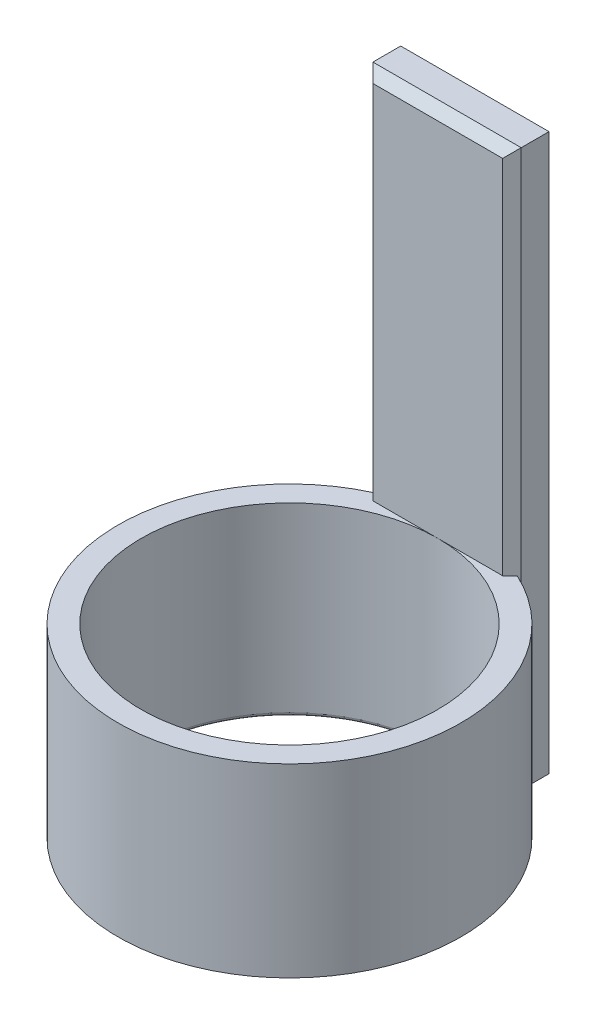
ISO-10303-21;
HEADER;
FILE_DESCRIPTION(('STEP AP214'),'2;1');
FILE_NAME('part.step','',(''),(''),'','','');
FILE_SCHEMA(('AUTOMOTIVE_DESIGN { 1 0 10303 214 1 1 1 1 }'));
ENDSEC;
DATA;
#1=APPLICATION_CONTEXT('core data for automotive mechanical design processes');
#2=APPLICATION_PROTOCOL_DEFINITION('international standard','automotive_design',2000,#1);
#3=PRODUCT_CONTEXT('',#1,'mechanical');
#4=PRODUCT('Part','Part','',(#3));
#5=PRODUCT_RELATED_PRODUCT_CATEGORY('part','',(#4));
#6=PRODUCT_DEFINITION_FORMATION('','',#4);
#7=PRODUCT_DEFINITION_CONTEXT('part definition',#1,'design');
#8=PRODUCT_DEFINITION('design','',#6,#7);
#9=PRODUCT_DEFINITION_SHAPE('','',#8);
#10=(LENGTH_UNIT() NAMED_UNIT(*) SI_UNIT(.MILLI.,.METRE.));
#11=(NAMED_UNIT(*) PLANE_ANGLE_UNIT() SI_UNIT($,.RADIAN.));
#12=(NAMED_UNIT(*) SI_UNIT($,.STERADIAN.) SOLID_ANGLE_UNIT());
#13=UNCERTAINTY_MEASURE_WITH_UNIT(LENGTH_MEASURE(1.E-05),#10,'distance_accuracy_value','');
#14=(GEOMETRIC_REPRESENTATION_CONTEXT(3) GLOBAL_UNCERTAINTY_ASSIGNED_CONTEXT((#13)) GLOBAL_UNIT_ASSIGNED_CONTEXT((#10,
#11,#12)) REPRESENTATION_CONTEXT('',''));
#15=CARTESIAN_POINT('',(0.,0.,0.));
#16=DIRECTION('',(0.,0.,1.));
#17=DIRECTION('',(1.,0.,0.));
#18=AXIS2_PLACEMENT_3D('',#15,#16,#17);
#19=CARTESIAN_POINT('',(0.,10.,0.));
#20=DIRECTION('',(0.,1.,0.));
#21=DIRECTION('',(0.,0.,1.));
#22=AXIS2_PLACEMENT_3D('',#19,#20,#21);
#23=PLANE('',#22);
#24=CARTESIAN_POINT('',(0.,10.,0.));
#25=DIRECTION('',(0.,1.,0.));
#26=DIRECTION('',(0.,0.,1.));
#27=AXIS2_PLACEMENT_3D('',#24,#25,#26);
#28=CIRCLE('',#27,9.25);
#29=CARTESIAN_POINT('',(-3.89155924826912,10.,-8.39155924826912));
#30=VERTEX_POINT('',#29);
#31=CARTESIAN_POINT('',(3.89155924826912,10.,-8.39155924826912));
#32=VERTEX_POINT('',#31);
#33=EDGE_CURVE('E52',#30,#32,#28,.T.);
#34=ORIENTED_EDGE('',*,*,#33,.T.);
#35=DIRECTION('',(0.707106781186548,0.,-0.707106781186548));
#36=VECTOR('',#35,1.);
#37=CARTESIAN_POINT('',(3.5,10.,-8.));
#38=LINE('',#37,#36);
#39=CARTESIAN_POINT('',(3.5,10.,-8.));
#40=VERTEX_POINT('',#39);
#41=EDGE_CURVE('E11',#32,#40,#38,.F.);
#42=ORIENTED_EDGE('',*,*,#41,.T.);
#43=DIRECTION('',(1.,0.,0.));
#44=VECTOR('',#43,1.);
#45=CARTESIAN_POINT('',(0.,10.,-8.));
#46=LINE('',#45,#44);
#47=CARTESIAN_POINT('',(0.,10.,-8.));
#48=VERTEX_POINT('',#47);
#49=EDGE_CURVE('E136',#48,#40,#46,.T.);
#50=ORIENTED_EDGE('',*,*,#49,.F.);
#51=CARTESIAN_POINT('',(0.,10.,0.));
#52=DIRECTION('',(0.,1.,0.));
#53=DIRECTION('',(0.,0.,1.));
#54=AXIS2_PLACEMENT_3D('',#51,#52,#53);
#55=CIRCLE('',#54,8.);
#56=EDGE_CURVE('E144',#48,#48,#55,.T.);
#57=ORIENTED_EDGE('',*,*,#56,.F.);
#58=CARTESIAN_POINT('',(-3.5,10.,-8.));
#59=VERTEX_POINT('',#58);
#60=EDGE_CURVE('E143',#59,#48,#46,.T.);
#61=ORIENTED_EDGE('',*,*,#60,.F.);
#62=DIRECTION('',(0.707106781186548,0.,0.707106781186548));
#63=VECTOR('',#62,1.);
#64=CARTESIAN_POINT('',(-3.5,10.,-8.));
#65=LINE('',#64,#63);
#66=EDGE_CURVE('E173',#59,#30,#65,.F.);
#67=ORIENTED_EDGE('',*,*,#66,.T.);
#68=EDGE_LOOP('',(#34,#42,#50,#57,#61,#67));
#69=FACE_BOUND('',#68,.T.);
#70=ADVANCED_FACE('F35',(#69),#23,.T.);
#71=CARTESIAN_POINT('',(0.,0.,0.));
#72=DIRECTION('',(0.,1.,0.));
#73=DIRECTION('',(0.,0.,1.));
#74=AXIS2_PLACEMENT_3D('',#71,#72,#73);
#75=PLANE('',#74);
#76=CARTESIAN_POINT('',(0.,0.,0.));
#77=DIRECTION('',(0.,1.,0.));
#78=DIRECTION('',(0.,0.,1.));
#79=AXIS2_PLACEMENT_3D('',#76,#77,#78);
#80=CIRCLE('',#79,8.2);
#81=CARTESIAN_POINT('',(0.,0.,8.2));
#82=VERTEX_POINT('',#81);
#83=EDGE_CURVE('E149',#82,#82,#80,.T.);
#84=ORIENTED_EDGE('',*,*,#83,.T.);
#85=EDGE_LOOP('',(#84));
#86=FACE_BOUND('',#85,.T.);
#87=CARTESIAN_POINT('',(0.,0.,0.));
#88=DIRECTION('',(0.,1.,0.));
#89=DIRECTION('',(0.,0.,1.));
#90=AXIS2_PLACEMENT_3D('',#87,#88,#89);
#91=CIRCLE('',#90,9.25);
#92=CARTESIAN_POINT('',(-3.89155924826912,0.,-8.39155924826913));
#93=VERTEX_POINT('',#92);
#94=CARTESIAN_POINT('',(3.89155924826912,0.,-8.39155924826913));
#95=VERTEX_POINT('',#94);
#96=EDGE_CURVE('E147',#93,#95,#91,.T.);
#97=ORIENTED_EDGE('',*,*,#96,.F.);
#98=DIRECTION('',(0.707106781186548,0.,0.707106781186548));
#99=VECTOR('',#98,1.);
#100=CARTESIAN_POINT('',(-3.5,0.,-8.));
#101=LINE('',#100,#99);
#102=CARTESIAN_POINT('',(-4.,0.,-8.5));
#103=VERTEX_POINT('',#102);
#104=EDGE_CURVE('E166',#93,#103,#101,.F.);
#105=ORIENTED_EDGE('',*,*,#104,.T.);
#106=DIRECTION('',(0.,0.,1.));
#107=VECTOR('',#106,1.);
#108=CARTESIAN_POINT('',(-4.,0.,-10.));
#109=LINE('',#108,#107);
#110=CARTESIAN_POINT('',(-4.,0.,-10.));
#111=VERTEX_POINT('',#110);
#112=EDGE_CURVE('E137',#111,#103,#109,.T.);
#113=ORIENTED_EDGE('',*,*,#112,.F.);
#114=DIRECTION('',(1.,0.,0.));
#115=VECTOR('',#114,1.);
#116=CARTESIAN_POINT('',(4.,0.,-10.));
#117=LINE('',#116,#115);
#118=CARTESIAN_POINT('',(4.,0.,-10.));
#119=VERTEX_POINT('',#118);
#120=EDGE_CURVE('E114',#111,#119,#117,.T.);
#121=ORIENTED_EDGE('',*,*,#120,.T.);
#122=DIRECTION('',(0.,0.,1.));
#123=VECTOR('',#122,1.);
#124=CARTESIAN_POINT('',(4.,0.,-10.));
#125=LINE('',#124,#123);
#126=CARTESIAN_POINT('',(4.,0.,-8.5));
#127=VERTEX_POINT('',#126);
#128=EDGE_CURVE('E128',#119,#127,#125,.T.);
#129=ORIENTED_EDGE('',*,*,#128,.T.);
#130=DIRECTION('',(0.707106781186548,0.,-0.707106781186548));
#131=VECTOR('',#130,1.);
#132=CARTESIAN_POINT('',(3.5,0.,-8.));
#133=LINE('',#132,#131);
#134=EDGE_CURVE('E163',#127,#95,#133,.F.);
#135=ORIENTED_EDGE('',*,*,#134,.T.);
#136=EDGE_LOOP('',(#97,#105,#113,#121,#129,#135));
#137=FACE_BOUND('',#136,.T.);
#138=ADVANCED_FACE('F194',(#86,#137),#75,.F.);
#139=CARTESIAN_POINT('',(0.,10.,0.));
#140=DIRECTION('',(0.,-1.,0.));
#141=DIRECTION('',(0.,0.,-1.));
#142=AXIS2_PLACEMENT_3D('',#139,#140,#141);
#143=CYLINDRICAL_SURFACE('',#142,9.25);
#144=ORIENTED_EDGE('',*,*,#96,.T.);
#145=DIRECTION('',(0.,-1.,0.));
#146=VECTOR('',#145,1.);
#147=CARTESIAN_POINT('',(3.89155924826912,0.,-8.39155924826913));
#148=LINE('',#147,#146);
#149=EDGE_CURVE('E45',#95,#32,#148,.F.);
#150=ORIENTED_EDGE('',*,*,#149,.T.);
#151=ORIENTED_EDGE('',*,*,#33,.F.);
#152=DIRECTION('',(0.,-1.,0.));
#153=VECTOR('',#152,1.);
#154=CARTESIAN_POINT('',(-3.89155924826912,10.,-8.39155924826912));
#155=LINE('',#154,#153);
#156=EDGE_CURVE('E175',#30,#93,#155,.T.);
#157=ORIENTED_EDGE('',*,*,#156,.T.);
#158=EDGE_LOOP('',(#144,#150,#151,#157));
#159=FACE_BOUND('',#158,.T.);
#160=ADVANCED_FACE('F212',(#159),#143,.T.);
#161=CARTESIAN_POINT('',(0.,10.,0.));
#162=DIRECTION('',(0.,-1.,0.));
#163=DIRECTION('',(0.,0.,-1.));
#164=AXIS2_PLACEMENT_3D('',#161,#162,#163);
#165=CYLINDRICAL_SURFACE('',#164,8.);
#166=CARTESIAN_POINT('',(0.,0.200000000000001,0.));
#167=DIRECTION('',(0.,1.,0.));
#168=DIRECTION('',(0.,0.,1.));
#169=AXIS2_PLACEMENT_3D('',#166,#167,#168);
#170=CIRCLE('',#169,8.);
#171=CARTESIAN_POINT('',(0.,0.200000000000001,8.));
#172=VERTEX_POINT('',#171);
#173=EDGE_CURVE('E153',#172,#172,#170,.F.);
#174=ORIENTED_EDGE('',*,*,#173,.T.);
#175=EDGE_LOOP('',(#174));
#176=FACE_BOUND('',#175,.T.);
#177=ORIENTED_EDGE('',*,*,#56,.T.);
#178=EDGE_LOOP('',(#177));
#179=FACE_BOUND('',#178,.T.);
#180=ADVANCED_FACE('F204',(#176,#179),#165,.F.);
#181=CARTESIAN_POINT('',(4.,0.,-10.));
#182=DIRECTION('',(1.,0.,0.));
#183=DIRECTION('',(0.,0.,-1.));
#184=AXIS2_PLACEMENT_3D('',#181,#182,#183);
#185=PLANE('',#184);
#186=DIRECTION('',(0.,0.,1.));
#187=VECTOR('',#186,1.);
#188=CARTESIAN_POINT('',(4.,30.,-10.));
#189=LINE('',#188,#187);
#190=CARTESIAN_POINT('',(4.,30.,-10.));
#191=VERTEX_POINT('',#190);
#192=CARTESIAN_POINT('',(4.,30.,-8.5));
#193=VERTEX_POINT('',#192);
#194=EDGE_CURVE('E103',#191,#193,#189,.T.);
#195=ORIENTED_EDGE('',*,*,#194,.T.);
#196=DIRECTION('',(0.,-1.,0.));
#197=VECTOR('',#196,1.);
#198=CARTESIAN_POINT('',(4.,0.,-8.5));
#199=LINE('',#198,#197);
#200=EDGE_CURVE('E171',#193,#127,#199,.T.);
#201=ORIENTED_EDGE('',*,*,#200,.T.);
#202=ORIENTED_EDGE('',*,*,#128,.F.);
#203=DIRECTION('',(0.,1.,0.));
#204=VECTOR('',#203,1.);
#205=CARTESIAN_POINT('',(4.,0.,-10.));
#206=LINE('',#205,#204);
#207=EDGE_CURVE('E121',#119,#191,#206,.T.);
#208=ORIENTED_EDGE('',*,*,#207,.T.);
#209=EDGE_LOOP('',(#195,#201,#202,#208));
#210=FACE_BOUND('',#209,.T.);
#211=ADVANCED_FACE('F126',(#210),#185,.T.);
#212=CARTESIAN_POINT('',(-4.,0.,-10.));
#213=DIRECTION('',(-1.,0.,0.));
#214=DIRECTION('',(0.,-1.,0.));
#215=AXIS2_PLACEMENT_3D('',#212,#213,#214);
#216=PLANE('',#215);
#217=ORIENTED_EDGE('',*,*,#112,.T.);
#218=DIRECTION('',(0.,1.,0.));
#219=VECTOR('',#218,1.);
#220=CARTESIAN_POINT('',(-4.,0.,-8.5));
#221=LINE('',#220,#219);
#222=CARTESIAN_POINT('',(-4.,30.,-8.5));
#223=VERTEX_POINT('',#222);
#224=EDGE_CURVE('E168',#103,#223,#221,.T.);
#225=ORIENTED_EDGE('',*,*,#224,.T.);
#226=DIRECTION('',(0.,0.,1.));
#227=VECTOR('',#226,1.);
#228=CARTESIAN_POINT('',(-4.,30.,-10.));
#229=LINE('',#228,#227);
#230=CARTESIAN_POINT('',(-4.,30.,-10.));
#231=VERTEX_POINT('',#230);
#232=EDGE_CURVE('E113',#231,#223,#229,.T.);
#233=ORIENTED_EDGE('',*,*,#232,.F.);
#234=DIRECTION('',(0.,-1.,0.));
#235=VECTOR('',#234,1.);
#236=CARTESIAN_POINT('',(-4.,0.,-10.));
#237=LINE('',#236,#235);
#238=EDGE_CURVE('E124',#231,#111,#237,.T.);
#239=ORIENTED_EDGE('',*,*,#238,.T.);
#240=EDGE_LOOP('',(#217,#225,#233,#239));
#241=FACE_BOUND('',#240,.T.);
#242=ADVANCED_FACE('F196',(#241),#216,.T.);
#243=CARTESIAN_POINT('',(4.,30.,-10.));
#244=DIRECTION('',(0.,1.,0.));
#245=DIRECTION('',(0.,0.,1.));
#246=AXIS2_PLACEMENT_3D('',#243,#244,#245);
#247=PLANE('',#246);
#248=ORIENTED_EDGE('',*,*,#232,.T.);
#249=DIRECTION('',(1.,0.,0.));
#250=VECTOR('',#249,1.);
#251=CARTESIAN_POINT('',(4.,30.,-8.5));
#252=LINE('',#251,#250);
#253=EDGE_CURVE('E109',#223,#193,#252,.T.);
#254=ORIENTED_EDGE('',*,*,#253,.T.);
#255=ORIENTED_EDGE('',*,*,#194,.F.);
#256=DIRECTION('',(-1.,0.,0.));
#257=VECTOR('',#256,1.);
#258=CARTESIAN_POINT('',(4.,30.,-10.));
#259=LINE('',#258,#257);
#260=EDGE_CURVE('E107',#191,#231,#259,.T.);
#261=ORIENTED_EDGE('',*,*,#260,.T.);
#262=EDGE_LOOP('',(#248,#254,#255,#261));
#263=FACE_BOUND('',#262,.T.);
#264=ADVANCED_FACE('F106',(#263),#247,.T.);
#265=CARTESIAN_POINT('',(0.,0.,-10.));
#266=DIRECTION('',(0.,0.,1.));
#267=DIRECTION('',(1.,0.,0.));
#268=AXIS2_PLACEMENT_3D('',#265,#266,#267);
#269=PLANE('',#268);
#270=ORIENTED_EDGE('',*,*,#207,.F.);
#271=ORIENTED_EDGE('',*,*,#120,.F.);
#272=ORIENTED_EDGE('',*,*,#238,.F.);
#273=ORIENTED_EDGE('',*,*,#260,.F.);
#274=EDGE_LOOP('',(#270,#271,#272,#273));
#275=FACE_BOUND('',#274,.T.);
#276=ADVANCED_FACE('F119',(#275),#269,.F.);
#277=CARTESIAN_POINT('',(0.,0.,-8.));
#278=DIRECTION('',(0.,0.,1.));
#279=DIRECTION('',(1.,0.,0.));
#280=AXIS2_PLACEMENT_3D('',#277,#278,#279);
#281=PLANE('',#280);
#282=DIRECTION('',(-1.,0.,0.));
#283=VECTOR('',#282,1.);
#284=CARTESIAN_POINT('',(0.,29.5,-8.));
#285=LINE('',#284,#283);
#286=CARTESIAN_POINT('',(3.5,29.5,-8.));
#287=VERTEX_POINT('',#286);
#288=CARTESIAN_POINT('',(-3.5,29.5,-8.));
#289=VERTEX_POINT('',#288);
#290=EDGE_CURVE('E158',#287,#289,#285,.T.);
#291=ORIENTED_EDGE('',*,*,#290,.T.);
#292=DIRECTION('',(0.,-1.,0.));
#293=VECTOR('',#292,1.);
#294=CARTESIAN_POINT('',(-3.5,0.,-8.));
#295=LINE('',#294,#293);
#296=EDGE_CURVE('E160',#289,#59,#295,.T.);
#297=ORIENTED_EDGE('',*,*,#296,.T.);
#298=ORIENTED_EDGE('',*,*,#60,.T.);
#299=ORIENTED_EDGE('',*,*,#49,.T.);
#300=DIRECTION('',(0.,1.,0.));
#301=VECTOR('',#300,1.);
#302=CARTESIAN_POINT('',(3.5,0.,-8.));
#303=LINE('',#302,#301);
#304=EDGE_CURVE('E156',#40,#287,#303,.T.);
#305=ORIENTED_EDGE('',*,*,#304,.T.);
#306=EDGE_LOOP('',(#291,#297,#298,#299,#305));
#307=FACE_BOUND('',#306,.T.);
#308=ADVANCED_FACE('F222',(#307),#281,.T.);
#309=CARTESIAN_POINT('',(0.,0.200000000000001,0.));
#310=DIRECTION('',(0.,1.,0.));
#311=DIRECTION('',(0.,0.,1.));
#312=AXIS2_PLACEMENT_3D('',#309,#310,#311);
#313=TOROIDAL_SURFACE('',#312,8.2,0.2);
#314=ORIENTED_EDGE('',*,*,#173,.F.);
#315=EDGE_LOOP('',(#314));
#316=FACE_BOUND('',#315,.T.);
#317=ORIENTED_EDGE('',*,*,#83,.F.);
#318=EDGE_LOOP('',(#317));
#319=FACE_BOUND('',#318,.T.);
#320=ADVANCED_FACE('F219',(#316,#319),#313,.T.);
#321=CARTESIAN_POINT('',(3.5,0.,-8.));
#322=DIRECTION('',(-0.707106781186547,0.,-0.707106781186547));
#323=DIRECTION('',(0.,1.,0.));
#324=AXIS2_PLACEMENT_3D('',#321,#322,#323);
#325=PLANE('',#324);
#326=ORIENTED_EDGE('',*,*,#134,.F.);
#327=ORIENTED_EDGE('',*,*,#200,.F.);
#328=DIRECTION('',(-0.577350269189626,-0.577350269189626,0.577350269189626));
#329=VECTOR('',#328,1.);
#330=CARTESIAN_POINT('',(-6.33333333333334,19.6666666666667,1.83333333333333));
#331=LINE('',#330,#329);
#332=EDGE_CURVE('E40',#287,#193,#331,.F.);
#333=ORIENTED_EDGE('',*,*,#332,.F.);
#334=ORIENTED_EDGE('',*,*,#304,.F.);
#335=ORIENTED_EDGE('',*,*,#41,.F.);
#336=ORIENTED_EDGE('',*,*,#149,.F.);
#337=EDGE_LOOP('',(#326,#327,#333,#334,#335,#336));
#338=FACE_BOUND('',#337,.T.);
#339=ADVANCED_FACE('F38',(#338),#325,.F.);
#340=CARTESIAN_POINT('',(0.,29.5,-8.));
#341=DIRECTION('',(0.,-0.707106781186547,-0.707106781186547));
#342=DIRECTION('',(-1.,0.,0.));
#343=AXIS2_PLACEMENT_3D('',#340,#341,#342);
#344=PLANE('',#343);
#345=ORIENTED_EDGE('',*,*,#332,.T.);
#346=ORIENTED_EDGE('',*,*,#253,.F.);
#347=DIRECTION('',(0.577350269189626,-0.577350269189626,0.577350269189626));
#348=VECTOR('',#347,1.);
#349=CARTESIAN_POINT('',(-2.33333333333333,28.3333333333333,-6.83333333333333));
#350=LINE('',#349,#348);
#351=EDGE_CURVE('E131',#289,#223,#350,.F.);
#352=ORIENTED_EDGE('',*,*,#351,.F.);
#353=ORIENTED_EDGE('',*,*,#290,.F.);
#354=EDGE_LOOP('',(#345,#346,#352,#353));
#355=FACE_BOUND('',#354,.T.);
#356=ADVANCED_FACE('F186',(#355),#344,.F.);
#357=CARTESIAN_POINT('',(-3.5,0.,-8.));
#358=DIRECTION('',(0.707106781186547,0.,-0.707106781186547));
#359=DIRECTION('',(0.,-1.,0.));
#360=AXIS2_PLACEMENT_3D('',#357,#358,#359);
#361=PLANE('',#360);
#362=ORIENTED_EDGE('',*,*,#351,.T.);
#363=ORIENTED_EDGE('',*,*,#224,.F.);
#364=ORIENTED_EDGE('',*,*,#104,.F.);
#365=ORIENTED_EDGE('',*,*,#156,.F.);
#366=ORIENTED_EDGE('',*,*,#66,.F.);
#367=ORIENTED_EDGE('',*,*,#296,.F.);
#368=EDGE_LOOP('',(#362,#363,#364,#365,#366,#367));
#369=FACE_BOUND('',#368,.T.);
#370=ADVANCED_FACE('F182',(#369),#361,.F.);
#371=CLOSED_SHELL('',(#70,#138,#160,#180,#211,#242,#264,#276,#308,#320,#339,#356,#370));
#372=MANIFOLD_SOLID_BREP('B2',#371);
#373=ADVANCED_BREP_SHAPE_REPRESENTATION('',(#18,#372),#14);
#374=SHAPE_DEFINITION_REPRESENTATION(#9,#373);
ENDSEC;
END-ISO-10303-21;
